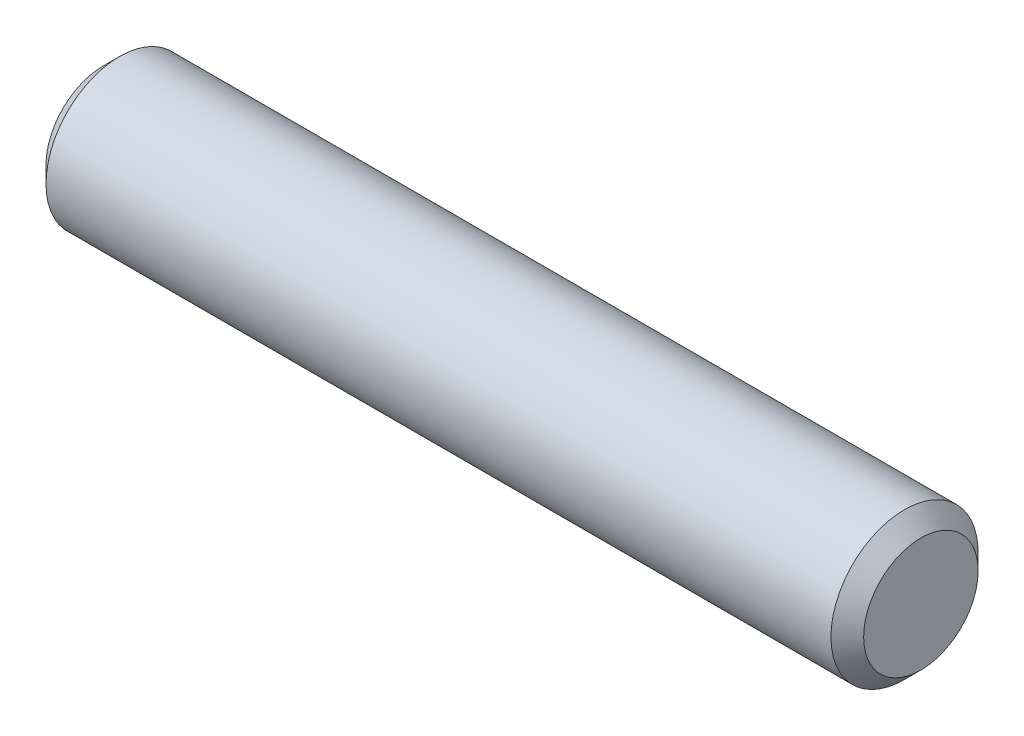
ISO-10303-21;
HEADER;
FILE_DESCRIPTION(('STEP AP214'),'2;1');
FILE_NAME('part.step','',(''),(''),'','','');
FILE_SCHEMA(('AUTOMOTIVE_DESIGN { 1 0 10303 214 1 1 1 1 }'));
ENDSEC;
DATA;
#1=APPLICATION_CONTEXT('core data for automotive mechanical design processes');
#2=APPLICATION_PROTOCOL_DEFINITION('international standard','automotive_design',2000,#1);
#3=PRODUCT_CONTEXT('',#1,'mechanical');
#4=PRODUCT('Part','Part','',(#3));
#5=PRODUCT_RELATED_PRODUCT_CATEGORY('part','',(#4));
#6=PRODUCT_DEFINITION_FORMATION('','',#4);
#7=PRODUCT_DEFINITION_CONTEXT('part definition',#1,'design');
#8=PRODUCT_DEFINITION('design','',#6,#7);
#9=PRODUCT_DEFINITION_SHAPE('','',#8);
#10=(LENGTH_UNIT() NAMED_UNIT(*) SI_UNIT(.MILLI.,.METRE.));
#11=(NAMED_UNIT(*) PLANE_ANGLE_UNIT() SI_UNIT($,.RADIAN.));
#12=(NAMED_UNIT(*) SI_UNIT($,.STERADIAN.) SOLID_ANGLE_UNIT());
#13=UNCERTAINTY_MEASURE_WITH_UNIT(LENGTH_MEASURE(1.E-05),#10,'distance_accuracy_value','');
#14=(GEOMETRIC_REPRESENTATION_CONTEXT(3) GLOBAL_UNCERTAINTY_ASSIGNED_CONTEXT((#13)) GLOBAL_UNIT_ASSIGNED_CONTEXT((#10,
#11,#12)) REPRESENTATION_CONTEXT('',''));
#15=CARTESIAN_POINT('',(0.,0.,0.));
#16=DIRECTION('',(0.,0.,1.));
#17=DIRECTION('',(1.,0.,0.));
#18=AXIS2_PLACEMENT_3D('',#15,#16,#17);
#19=CARTESIAN_POINT('',(-5.34269662921348,0.,0.));
#20=DIRECTION('',(1.,0.,0.));
#21=DIRECTION('',(0.,0.,-1.));
#22=AXIS2_PLACEMENT_3D('',#19,#20,#21);
#23=PLANE('',#22);
#24=CARTESIAN_POINT('',(-5.34269662921348,0.,0.));
#25=DIRECTION('',(1.,0.,0.));
#26=DIRECTION('',(0.,0.,-1.));
#27=AXIS2_PLACEMENT_3D('',#24,#25,#26);
#28=CIRCLE('',#27,0.699999999999998);
#29=CARTESIAN_POINT('',(-5.34269662921348,0.,-0.699999999999998));
#30=VERTEX_POINT('',#29);
#31=EDGE_CURVE('E50',#30,#30,#28,.F.);
#32=ORIENTED_EDGE('',*,*,#31,.T.);
#33=EDGE_LOOP('',(#32));
#34=FACE_BOUND('',#33,.T.);
#35=ADVANCED_FACE('F35',(#34),#23,.F.);
#36=CARTESIAN_POINT('',(-6.32022471910112,0.,0.));
#37=DIRECTION('',(-1.,0.,0.));
#38=DIRECTION('',(0.,0.,1.));
#39=AXIS2_PLACEMENT_3D('',#36,#37,#38);
#40=CYLINDRICAL_SURFACE('',#39,0.9);
#41=CARTESIAN_POINT('',(-5.14269662921348,0.,0.));
#42=DIRECTION('',(1.,0.,0.));
#43=DIRECTION('',(0.,0.,-1.));
#44=AXIS2_PLACEMENT_3D('',#41,#42,#43);
#45=CIRCLE('',#44,0.9);
#46=CARTESIAN_POINT('',(-5.14269662921348,0.,-0.9));
#47=VERTEX_POINT('',#46);
#48=EDGE_CURVE('E42',#47,#47,#45,.T.);
#49=ORIENTED_EDGE('',*,*,#48,.T.);
#50=EDGE_LOOP('',(#49));
#51=FACE_BOUND('',#50,.T.);
#52=CARTESIAN_POINT('',(4.45730337078652,0.,0.));
#53=DIRECTION('',(-1.,0.,0.));
#54=DIRECTION('',(0.,0.,1.));
#55=AXIS2_PLACEMENT_3D('',#52,#53,#54);
#56=CIRCLE('',#55,0.9);
#57=CARTESIAN_POINT('',(4.45730337078652,0.,0.9));
#58=VERTEX_POINT('',#57);
#59=EDGE_CURVE('E46',#58,#58,#56,.T.);
#60=ORIENTED_EDGE('',*,*,#59,.T.);
#61=EDGE_LOOP('',(#60));
#62=FACE_BOUND('',#61,.T.);
#63=ADVANCED_FACE('F66',(#51,#62),#40,.T.);
#64=CARTESIAN_POINT('',(4.65730337078652,0.9,0.));
#65=DIRECTION('',(-1.,0.,0.));
#66=DIRECTION('',(0.,0.,1.));
#67=AXIS2_PLACEMENT_3D('',#64,#65,#66);
#68=PLANE('',#67);
#69=CARTESIAN_POINT('',(4.65730337078652,0.,0.));
#70=DIRECTION('',(-1.,0.,0.));
#71=DIRECTION('',(0.,0.,1.));
#72=AXIS2_PLACEMENT_3D('',#69,#70,#71);
#73=CIRCLE('',#72,0.699999999999998);
#74=CARTESIAN_POINT('',(4.65730337078652,0.,0.699999999999998));
#75=VERTEX_POINT('',#74);
#76=EDGE_CURVE('E10',#75,#75,#73,.F.);
#77=ORIENTED_EDGE('',*,*,#76,.T.);
#78=EDGE_LOOP('',(#77));
#79=FACE_BOUND('',#78,.T.);
#80=ADVANCED_FACE('F59',(#79),#68,.F.);
#81=CARTESIAN_POINT('',(-5.34269662921348,0.,0.));
#82=DIRECTION('',(1.,0.,0.));
#83=DIRECTION('',(0.,0.,-1.));
#84=AXIS2_PLACEMENT_3D('',#81,#82,#83);
#85=CONICAL_SURFACE('',#84,0.699999999999998,0.785398163397445);
#86=ORIENTED_EDGE('',*,*,#48,.F.);
#87=EDGE_LOOP('',(#86));
#88=FACE_BOUND('',#87,.T.);
#89=ORIENTED_EDGE('',*,*,#31,.F.);
#90=EDGE_LOOP('',(#89));
#91=FACE_BOUND('',#90,.T.);
#92=ADVANCED_FACE('F57',(#88,#91),#85,.T.);
#93=CARTESIAN_POINT('',(4.45730337078652,0.,0.));
#94=DIRECTION('',(-1.,0.,0.));
#95=DIRECTION('',(0.,0.,1.));
#96=AXIS2_PLACEMENT_3D('',#93,#94,#95);
#97=CONICAL_SURFACE('',#96,0.9,0.785398163397453);
#98=ORIENTED_EDGE('',*,*,#76,.F.);
#99=EDGE_LOOP('',(#98));
#100=FACE_BOUND('',#99,.T.);
#101=ORIENTED_EDGE('',*,*,#59,.F.);
#102=EDGE_LOOP('',(#101));
#103=FACE_BOUND('',#102,.T.);
#104=ADVANCED_FACE('F37',(#100,#103),#97,.T.);
#105=CLOSED_SHELL('',(#35,#63,#80,#92,#104));
#106=MANIFOLD_SOLID_BREP('B2',#105);
#107=ADVANCED_BREP_SHAPE_REPRESENTATION('',(#18,#106),#14);
#108=SHAPE_DEFINITION_REPRESENTATION(#9,#107);
ENDSEC;
END-ISO-10303-21;
